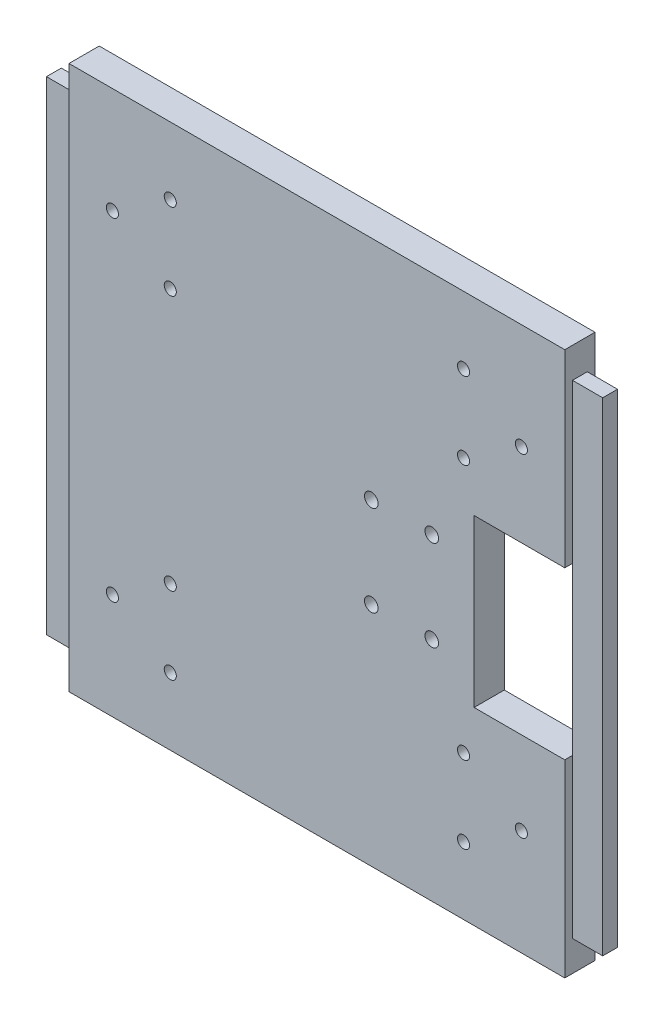
ISO-10303-21;
HEADER;
FILE_DESCRIPTION(('STEP AP214'),'2;1');
FILE_NAME('part.step','',(''),(''),'','','');
FILE_SCHEMA(('AUTOMOTIVE_DESIGN { 1 0 10303 214 1 1 1 1 }'));
ENDSEC;
DATA;
#1=APPLICATION_CONTEXT('core data for automotive mechanical design processes');
#2=APPLICATION_PROTOCOL_DEFINITION('international standard','automotive_design',2000,#1);
#3=PRODUCT_CONTEXT('',#1,'mechanical');
#4=PRODUCT('Part','Part','',(#3));
#5=PRODUCT_RELATED_PRODUCT_CATEGORY('part','',(#4));
#6=PRODUCT_DEFINITION_FORMATION('','',#4);
#7=PRODUCT_DEFINITION_CONTEXT('part definition',#1,'design');
#8=PRODUCT_DEFINITION('design','',#6,#7);
#9=PRODUCT_DEFINITION_SHAPE('','',#8);
#10=(LENGTH_UNIT() NAMED_UNIT(*) SI_UNIT(.MILLI.,.METRE.));
#11=(NAMED_UNIT(*) PLANE_ANGLE_UNIT() SI_UNIT($,.RADIAN.));
#12=(NAMED_UNIT(*) SI_UNIT($,.STERADIAN.) SOLID_ANGLE_UNIT());
#13=UNCERTAINTY_MEASURE_WITH_UNIT(LENGTH_MEASURE(1.E-05),#10,'distance_accuracy_value','');
#14=(GEOMETRIC_REPRESENTATION_CONTEXT(3) GLOBAL_UNCERTAINTY_ASSIGNED_CONTEXT((#13)) GLOBAL_UNIT_ASSIGNED_CONTEXT((#10,
#11,#12)) REPRESENTATION_CONTEXT('',''));
#15=CARTESIAN_POINT('',(0.,0.,0.));
#16=DIRECTION('',(0.,0.,1.));
#17=DIRECTION('',(1.,0.,0.));
#18=AXIS2_PLACEMENT_3D('',#15,#16,#17);
#19=CARTESIAN_POINT('',(164.,0.,10.));
#20=DIRECTION('',(-1.,0.,0.));
#21=DIRECTION('',(0.,0.,1.));
#22=AXIS2_PLACEMENT_3D('',#19,#20,#21);
#23=PLANE('',#22);
#24=DIRECTION('',(0.,0.,1.));
#25=VECTOR('',#24,1.);
#26=CARTESIAN_POINT('',(164.,117.5,0.));
#27=LINE('',#26,#25);
#28=CARTESIAN_POINT('',(164.,117.5,0.));
#29=VERTEX_POINT('',#28);
#30=CARTESIAN_POINT('',(164.,117.5,2.55));
#31=VERTEX_POINT('',#30);
#32=EDGE_CURVE('E52',#29,#31,#27,.T.);
#33=ORIENTED_EDGE('',*,*,#32,.F.);
#34=DIRECTION('',(0.,1.,0.));
#35=VECTOR('',#34,1.);
#36=CARTESIAN_POINT('',(164.,0.,0.));
#37=LINE('',#36,#35);
#38=CARTESIAN_POINT('',(164.,180.,0.));
#39=VERTEX_POINT('',#38);
#40=EDGE_CURVE('E390',#29,#39,#37,.T.);
#41=ORIENTED_EDGE('',*,*,#40,.T.);
#42=DIRECTION('',(0.,0.,-1.));
#43=VECTOR('',#42,1.);
#44=CARTESIAN_POINT('',(164.,180.,10.));
#45=LINE('',#44,#43);
#46=CARTESIAN_POINT('',(164.,180.,10.));
#47=VERTEX_POINT('',#46);
#48=EDGE_CURVE('E396',#47,#39,#45,.T.);
#49=ORIENTED_EDGE('',*,*,#48,.F.);
#50=DIRECTION('',(0.,1.,0.));
#51=VECTOR('',#50,1.);
#52=CARTESIAN_POINT('',(164.,0.,10.));
#53=LINE('',#52,#51);
#54=CARTESIAN_POINT('',(164.,117.5,10.));
#55=VERTEX_POINT('',#54);
#56=EDGE_CURVE('E379',#55,#47,#53,.T.);
#57=ORIENTED_EDGE('',*,*,#56,.F.);
#58=CARTESIAN_POINT('',(164.,117.5,7.45));
#59=VERTEX_POINT('',#58);
#60=EDGE_CURVE('E202',#59,#55,#27,.T.);
#61=ORIENTED_EDGE('',*,*,#60,.F.);
#62=DIRECTION('',(0.,1.,0.));
#63=VECTOR('',#62,1.);
#64=CARTESIAN_POINT('',(164.,169.95,7.44999999999999));
#65=LINE('',#64,#63);
#66=CARTESIAN_POINT('',(164.,169.95,7.44999999999999));
#67=VERTEX_POINT('',#66);
#68=EDGE_CURVE('E322',#59,#67,#65,.T.);
#69=ORIENTED_EDGE('',*,*,#68,.T.);
#70=DIRECTION('',(0.,0.,-1.));
#71=VECTOR('',#70,1.);
#72=CARTESIAN_POINT('',(164.,169.95,2.54999999999999));
#73=LINE('',#72,#71);
#74=CARTESIAN_POINT('',(164.,169.95,2.54999999999999));
#75=VERTEX_POINT('',#74);
#76=EDGE_CURVE('E319',#67,#75,#73,.T.);
#77=ORIENTED_EDGE('',*,*,#76,.T.);
#78=DIRECTION('',(0.,-1.,0.));
#79=VECTOR('',#78,1.);
#80=CARTESIAN_POINT('',(164.,169.95,2.54999999999999));
#81=LINE('',#80,#79);
#82=EDGE_CURVE('E316',#75,#31,#81,.T.);
#83=ORIENTED_EDGE('',*,*,#82,.T.);
#84=EDGE_LOOP('',(#33,#41,#49,#57,#61,#69,#77,#83));
#85=FACE_BOUND('',#84,.T.);
#86=ADVANCED_FACE('F37',(#85),#23,.F.);
#87=CARTESIAN_POINT('',(0.,0.,10.));
#88=DIRECTION('',(0.,0.,-1.));
#89=DIRECTION('',(-1.,0.,0.));
#90=AXIS2_PLACEMENT_3D('',#87,#88,#89);
#91=PLANE('',#90);
#92=CARTESIAN_POINT('',(149.642557300424,145.,10.));
#93=DIRECTION('',(0.,0.,-1.));
#94=DIRECTION('',(-1.,0.,0.));
#95=AXIS2_PLACEMENT_3D('',#92,#93,#94);
#96=CIRCLE('',#95,2.);
#97=CARTESIAN_POINT('',(147.642557300424,145.,10.));
#98=VERTEX_POINT('',#97);
#99=EDGE_CURVE('E296',#98,#98,#96,.T.);
#100=ORIENTED_EDGE('',*,*,#99,.T.);
#101=EDGE_LOOP('',(#100));
#102=FACE_BOUND('',#101,.T.);
#103=CARTESIAN_POINT('',(14.3574426995764,35.,10.));
#104=DIRECTION('',(0.,0.,-1.));
#105=DIRECTION('',(1.,0.,0.));
#106=AXIS2_PLACEMENT_3D('',#103,#104,#105);
#107=CIRCLE('',#106,2.);
#108=CARTESIAN_POINT('',(16.3574426995764,35.,10.));
#109=VERTEX_POINT('',#108);
#110=EDGE_CURVE('E243',#109,#109,#107,.T.);
#111=ORIENTED_EDGE('',*,*,#110,.T.);
#112=EDGE_LOOP('',(#111));
#113=FACE_BOUND('',#112,.T.);
#114=CARTESIAN_POINT('',(33.5,22.25,10.));
#115=DIRECTION('',(0.,0.,-1.));
#116=DIRECTION('',(1.,0.,0.));
#117=AXIS2_PLACEMENT_3D('',#114,#115,#116);
#118=CIRCLE('',#117,2.00000000000001);
#119=CARTESIAN_POINT('',(35.5,22.25,10.));
#120=VERTEX_POINT('',#119);
#121=EDGE_CURVE('E237',#120,#120,#118,.T.);
#122=ORIENTED_EDGE('',*,*,#121,.T.);
#123=EDGE_LOOP('',(#122));
#124=FACE_BOUND('',#123,.T.);
#125=CARTESIAN_POINT('',(33.5,47.75,10.));
#126=DIRECTION('',(0.,0.,-1.));
#127=DIRECTION('',(1.,0.,0.));
#128=AXIS2_PLACEMENT_3D('',#125,#126,#127);
#129=CIRCLE('',#128,2.);
#130=CARTESIAN_POINT('',(35.5,47.75,10.));
#131=VERTEX_POINT('',#130);
#132=EDGE_CURVE('E230',#131,#131,#129,.T.);
#133=ORIENTED_EDGE('',*,*,#132,.T.);
#134=EDGE_LOOP('',(#133));
#135=FACE_BOUND('',#134,.T.);
#136=CARTESIAN_POINT('',(130.5,157.75,10.));
#137=DIRECTION('',(0.,0.,-1.));
#138=DIRECTION('',(-1.,0.,0.));
#139=AXIS2_PLACEMENT_3D('',#136,#137,#138);
#140=CIRCLE('',#139,2.);
#141=CARTESIAN_POINT('',(128.5,157.75,10.));
#142=VERTEX_POINT('',#141);
#143=EDGE_CURVE('E272',#142,#142,#140,.T.);
#144=ORIENTED_EDGE('',*,*,#143,.T.);
#145=EDGE_LOOP('',(#144));
#146=FACE_BOUND('',#145,.T.);
#147=CARTESIAN_POINT('',(130.5,132.25,10.));
#148=DIRECTION('',(0.,0.,-1.));
#149=DIRECTION('',(-1.,0.,0.));
#150=AXIS2_PLACEMENT_3D('',#147,#148,#149);
#151=CIRCLE('',#150,2.);
#152=CARTESIAN_POINT('',(128.5,132.25,10.));
#153=VERTEX_POINT('',#152);
#154=EDGE_CURVE('E279',#153,#153,#151,.T.);
#155=ORIENTED_EDGE('',*,*,#154,.T.);
#156=EDGE_LOOP('',(#155));
#157=FACE_BOUND('',#156,.T.);
#158=CARTESIAN_POINT('',(14.3574426995764,145.,10.));
#159=DIRECTION('',(0.,0.,-1.));
#160=DIRECTION('',(-1.,0.,0.));
#161=AXIS2_PLACEMENT_3D('',#158,#159,#160);
#162=CIRCLE('',#161,2.);
#163=CARTESIAN_POINT('',(12.3574426995764,145.,10.));
#164=VERTEX_POINT('',#163);
#165=EDGE_CURVE('E285',#164,#164,#162,.T.);
#166=ORIENTED_EDGE('',*,*,#165,.T.);
#167=EDGE_LOOP('',(#166));
#168=FACE_BOUND('',#167,.T.);
#169=CARTESIAN_POINT('',(33.5,157.75,10.));
#170=DIRECTION('',(0.,0.,-1.));
#171=DIRECTION('',(-1.,0.,0.));
#172=AXIS2_PLACEMENT_3D('',#169,#170,#171);
#173=CIRCLE('',#172,2.00000000000001);
#174=CARTESIAN_POINT('',(31.5,157.75,10.));
#175=VERTEX_POINT('',#174);
#176=EDGE_CURVE('E291',#175,#175,#173,.T.);
#177=ORIENTED_EDGE('',*,*,#176,.T.);
#178=EDGE_LOOP('',(#177));
#179=FACE_BOUND('',#178,.T.);
#180=CARTESIAN_POINT('',(33.5,132.25,10.));
#181=DIRECTION('',(0.,0.,-1.));
#182=DIRECTION('',(-1.,0.,0.));
#183=AXIS2_PLACEMENT_3D('',#180,#181,#182);
#184=CIRCLE('',#183,2.);
#185=CARTESIAN_POINT('',(31.5,132.25,10.));
#186=VERTEX_POINT('',#185);
#187=EDGE_CURVE('E248',#186,#186,#184,.T.);
#188=ORIENTED_EDGE('',*,*,#187,.T.);
#189=EDGE_LOOP('',(#188));
#190=FACE_BOUND('',#189,.T.);
#191=CARTESIAN_POINT('',(130.5,47.75,10.));
#192=DIRECTION('',(0.,0.,-1.));
#193=DIRECTION('',(1.,0.,0.));
#194=AXIS2_PLACEMENT_3D('',#191,#192,#193);
#195=CIRCLE('',#194,2.);
#196=CARTESIAN_POINT('',(132.5,47.75,10.));
#197=VERTEX_POINT('',#196);
#198=EDGE_CURVE('E255',#197,#197,#195,.T.);
#199=ORIENTED_EDGE('',*,*,#198,.T.);
#200=EDGE_LOOP('',(#199));
#201=FACE_BOUND('',#200,.T.);
#202=CARTESIAN_POINT('',(130.5,22.25,10.));
#203=DIRECTION('',(0.,0.,-1.));
#204=DIRECTION('',(1.,0.,0.));
#205=AXIS2_PLACEMENT_3D('',#202,#203,#204);
#206=CIRCLE('',#205,2.);
#207=CARTESIAN_POINT('',(132.5,22.25,10.));
#208=VERTEX_POINT('',#207);
#209=EDGE_CURVE('E261',#208,#208,#206,.T.);
#210=ORIENTED_EDGE('',*,*,#209,.T.);
#211=EDGE_LOOP('',(#210));
#212=FACE_BOUND('',#211,.T.);
#213=CARTESIAN_POINT('',(149.642557300424,35.,10.));
#214=DIRECTION('',(0.,0.,-1.));
#215=DIRECTION('',(1.,0.,0.));
#216=AXIS2_PLACEMENT_3D('',#213,#214,#215);
#217=CIRCLE('',#216,2.);
#218=CARTESIAN_POINT('',(151.642557300424,35.,10.));
#219=VERTEX_POINT('',#218);
#220=EDGE_CURVE('E267',#219,#219,#217,.T.);
#221=ORIENTED_EDGE('',*,*,#220,.T.);
#222=EDGE_LOOP('',(#221));
#223=FACE_BOUND('',#222,.T.);
#224=CARTESIAN_POINT('',(120.,75.,10.));
#225=DIRECTION('',(0.,0.,1.));
#226=DIRECTION('',(1.,0.,0.));
#227=AXIS2_PLACEMENT_3D('',#224,#225,#226);
#228=CIRCLE('',#227,2.25);
#229=CARTESIAN_POINT('',(122.25,75.,10.));
#230=VERTEX_POINT('',#229);
#231=EDGE_CURVE('E221',#230,#230,#228,.T.);
#232=ORIENTED_EDGE('',*,*,#231,.F.);
#233=EDGE_LOOP('',(#232));
#234=FACE_BOUND('',#233,.T.);
#235=CARTESIAN_POINT('',(99.9999999999999,74.9999999999998,10.));
#236=DIRECTION('',(0.,0.,1.));
#237=DIRECTION('',(1.,0.,0.));
#238=AXIS2_PLACEMENT_3D('',#235,#236,#237);
#239=CIRCLE('',#238,2.25);
#240=CARTESIAN_POINT('',(102.25,74.9999999999998,10.));
#241=VERTEX_POINT('',#240);
#242=EDGE_CURVE('E215',#241,#241,#239,.T.);
#243=ORIENTED_EDGE('',*,*,#242,.F.);
#244=EDGE_LOOP('',(#243));
#245=FACE_BOUND('',#244,.T.);
#246=CARTESIAN_POINT('',(99.9999999999999,105.,10.));
#247=DIRECTION('',(0.,0.,1.));
#248=DIRECTION('',(1.,0.,0.));
#249=AXIS2_PLACEMENT_3D('',#246,#247,#248);
#250=CIRCLE('',#249,2.25);
#251=CARTESIAN_POINT('',(102.25,105.,10.));
#252=VERTEX_POINT('',#251);
#253=EDGE_CURVE('E209',#252,#252,#250,.T.);
#254=ORIENTED_EDGE('',*,*,#253,.F.);
#255=EDGE_LOOP('',(#254));
#256=FACE_BOUND('',#255,.T.);
#257=CARTESIAN_POINT('',(120.,105.,10.));
#258=DIRECTION('',(0.,0.,1.));
#259=DIRECTION('',(1.,0.,0.));
#260=AXIS2_PLACEMENT_3D('',#257,#258,#259);
#261=CIRCLE('',#260,2.25);
#262=CARTESIAN_POINT('',(122.25,105.,10.));
#263=VERTEX_POINT('',#262);
#264=EDGE_CURVE('E195',#263,#263,#261,.T.);
#265=ORIENTED_EDGE('',*,*,#264,.F.);
#266=EDGE_LOOP('',(#265));
#267=FACE_BOUND('',#266,.T.);
#268=DIRECTION('',(1.,0.,0.));
#269=VECTOR('',#268,1.);
#270=CARTESIAN_POINT('',(134.,117.5,10.));
#271=LINE('',#270,#269);
#272=CARTESIAN_POINT('',(134.,117.5,10.));
#273=VERTEX_POINT('',#272);
#274=EDGE_CURVE('E187',#273,#55,#271,.T.);
#275=ORIENTED_EDGE('',*,*,#274,.T.);
#276=ORIENTED_EDGE('',*,*,#56,.T.);
#277=DIRECTION('',(-1.,0.,0.));
#278=VECTOR('',#277,1.);
#279=CARTESIAN_POINT('',(0.,180.,10.));
#280=LINE('',#279,#278);
#281=CARTESIAN_POINT('',(0.,180.,10.));
#282=VERTEX_POINT('',#281);
#283=EDGE_CURVE('E383',#47,#282,#280,.T.);
#284=ORIENTED_EDGE('',*,*,#283,.T.);
#285=DIRECTION('',(0.,-1.,0.));
#286=VECTOR('',#285,1.);
#287=CARTESIAN_POINT('',(0.,0.,10.));
#288=LINE('',#287,#286);
#289=CARTESIAN_POINT('',(0.,0.,10.));
#290=VERTEX_POINT('',#289);
#291=EDGE_CURVE('E373',#282,#290,#288,.T.);
#292=ORIENTED_EDGE('',*,*,#291,.T.);
#293=DIRECTION('',(1.,0.,0.));
#294=VECTOR('',#293,1.);
#295=CARTESIAN_POINT('',(0.,0.,10.));
#296=LINE('',#295,#294);
#297=CARTESIAN_POINT('',(164.,0.,10.));
#298=VERTEX_POINT('',#297);
#299=EDGE_CURVE('E376',#290,#298,#296,.T.);
#300=ORIENTED_EDGE('',*,*,#299,.T.);
#301=CARTESIAN_POINT('',(164.,62.5,10.));
#302=VERTEX_POINT('',#301);
#303=EDGE_CURVE('E380',#298,#302,#53,.T.);
#304=ORIENTED_EDGE('',*,*,#303,.T.);
#305=DIRECTION('',(1.,0.,0.));
#306=VECTOR('',#305,1.);
#307=CARTESIAN_POINT('',(134.,62.5,10.));
#308=LINE('',#307,#306);
#309=CARTESIAN_POINT('',(134.,62.5,10.));
#310=VERTEX_POINT('',#309);
#311=EDGE_CURVE('E190',#310,#302,#308,.T.);
#312=ORIENTED_EDGE('',*,*,#311,.F.);
#313=DIRECTION('',(0.,-1.,0.));
#314=VECTOR('',#313,1.);
#315=CARTESIAN_POINT('',(134.,117.5,10.));
#316=LINE('',#315,#314);
#317=EDGE_CURVE('E170',#273,#310,#316,.T.);
#318=ORIENTED_EDGE('',*,*,#317,.F.);
#319=EDGE_LOOP('',(#275,#276,#284,#292,#300,#304,#312,#318));
#320=FACE_BOUND('',#319,.T.);
#321=ADVANCED_FACE('F440',(#102,#113,#124,#135,#146,#157,#168,#179,#190,#201,#212,#223,#234,
#245,#256,#267,#320),#91,.F.);
#322=CARTESIAN_POINT('',(0.,0.,0.));
#323=DIRECTION('',(0.,0.,-1.));
#324=DIRECTION('',(-1.,0.,0.));
#325=AXIS2_PLACEMENT_3D('',#322,#323,#324);
#326=PLANE('',#325);
#327=CARTESIAN_POINT('',(120.,105.,0.));
#328=DIRECTION('',(0.,0.,1.));
#329=DIRECTION('',(1.,0.,0.));
#330=AXIS2_PLACEMENT_3D('',#327,#328,#329);
#331=CIRCLE('',#330,2.25);
#332=CARTESIAN_POINT('',(122.25,105.,0.));
#333=VERTEX_POINT('',#332);
#334=EDGE_CURVE('E206',#333,#333,#331,.T.);
#335=ORIENTED_EDGE('',*,*,#334,.T.);
#336=EDGE_LOOP('',(#335));
#337=FACE_BOUND('',#336,.T.);
#338=CARTESIAN_POINT('',(99.9999999999999,105.,0.));
#339=DIRECTION('',(0.,0.,1.));
#340=DIRECTION('',(1.,0.,0.));
#341=AXIS2_PLACEMENT_3D('',#338,#339,#340);
#342=CIRCLE('',#341,2.25);
#343=CARTESIAN_POINT('',(102.25,105.,0.));
#344=VERTEX_POINT('',#343);
#345=EDGE_CURVE('E212',#344,#344,#342,.T.);
#346=ORIENTED_EDGE('',*,*,#345,.T.);
#347=EDGE_LOOP('',(#346));
#348=FACE_BOUND('',#347,.T.);
#349=CARTESIAN_POINT('',(99.9999999999999,74.9999999999998,0.));
#350=DIRECTION('',(0.,0.,1.));
#351=DIRECTION('',(1.,0.,0.));
#352=AXIS2_PLACEMENT_3D('',#349,#350,#351);
#353=CIRCLE('',#352,2.25);
#354=CARTESIAN_POINT('',(102.25,74.9999999999998,0.));
#355=VERTEX_POINT('',#354);
#356=EDGE_CURVE('E218',#355,#355,#353,.T.);
#357=ORIENTED_EDGE('',*,*,#356,.T.);
#358=EDGE_LOOP('',(#357));
#359=FACE_BOUND('',#358,.T.);
#360=CARTESIAN_POINT('',(120.,75.,0.));
#361=DIRECTION('',(0.,0.,1.));
#362=DIRECTION('',(1.,0.,0.));
#363=AXIS2_PLACEMENT_3D('',#360,#361,#362);
#364=CIRCLE('',#363,2.25);
#365=CARTESIAN_POINT('',(122.25,75.,0.));
#366=VERTEX_POINT('',#365);
#367=EDGE_CURVE('E224',#366,#366,#364,.T.);
#368=ORIENTED_EDGE('',*,*,#367,.T.);
#369=EDGE_LOOP('',(#368));
#370=FACE_BOUND('',#369,.T.);
#371=CARTESIAN_POINT('',(149.642557300424,35.,0.));
#372=DIRECTION('',(0.,0.,-1.));
#373=DIRECTION('',(1.,0.,0.));
#374=AXIS2_PLACEMENT_3D('',#371,#372,#373);
#375=CIRCLE('',#374,2.);
#376=CARTESIAN_POINT('',(151.642557300424,35.,0.));
#377=VERTEX_POINT('',#376);
#378=EDGE_CURVE('E233',#377,#377,#375,.T.);
#379=ORIENTED_EDGE('',*,*,#378,.F.);
#380=EDGE_LOOP('',(#379));
#381=FACE_BOUND('',#380,.T.);
#382=CARTESIAN_POINT('',(130.5,22.25,0.));
#383=DIRECTION('',(0.,0.,-1.));
#384=DIRECTION('',(1.,0.,0.));
#385=AXIS2_PLACEMENT_3D('',#382,#383,#384);
#386=CIRCLE('',#385,2.);
#387=CARTESIAN_POINT('',(132.5,22.25,0.));
#388=VERTEX_POINT('',#387);
#389=EDGE_CURVE('E264',#388,#388,#386,.T.);
#390=ORIENTED_EDGE('',*,*,#389,.F.);
#391=EDGE_LOOP('',(#390));
#392=FACE_BOUND('',#391,.T.);
#393=CARTESIAN_POINT('',(130.5,47.75,0.));
#394=DIRECTION('',(0.,0.,-1.));
#395=DIRECTION('',(1.,0.,0.));
#396=AXIS2_PLACEMENT_3D('',#393,#394,#395);
#397=CIRCLE('',#396,2.);
#398=CARTESIAN_POINT('',(132.5,47.75,0.));
#399=VERTEX_POINT('',#398);
#400=EDGE_CURVE('E258',#399,#399,#397,.T.);
#401=ORIENTED_EDGE('',*,*,#400,.F.);
#402=EDGE_LOOP('',(#401));
#403=FACE_BOUND('',#402,.T.);
#404=CARTESIAN_POINT('',(33.5,132.25,0.));
#405=DIRECTION('',(0.,0.,-1.));
#406=DIRECTION('',(-1.,0.,0.));
#407=AXIS2_PLACEMENT_3D('',#404,#405,#406);
#408=CIRCLE('',#407,2.);
#409=CARTESIAN_POINT('',(31.5,132.25,0.));
#410=VERTEX_POINT('',#409);
#411=EDGE_CURVE('E252',#410,#410,#408,.T.);
#412=ORIENTED_EDGE('',*,*,#411,.F.);
#413=EDGE_LOOP('',(#412));
#414=FACE_BOUND('',#413,.T.);
#415=CARTESIAN_POINT('',(33.5,157.75,0.));
#416=DIRECTION('',(0.,0.,-1.));
#417=DIRECTION('',(-1.,0.,0.));
#418=AXIS2_PLACEMENT_3D('',#415,#416,#417);
#419=CIRCLE('',#418,2.00000000000001);
#420=CARTESIAN_POINT('',(31.5,157.75,0.));
#421=VERTEX_POINT('',#420);
#422=EDGE_CURVE('E251',#421,#421,#419,.T.);
#423=ORIENTED_EDGE('',*,*,#422,.F.);
#424=EDGE_LOOP('',(#423));
#425=FACE_BOUND('',#424,.T.);
#426=CARTESIAN_POINT('',(14.3574426995764,145.,0.));
#427=DIRECTION('',(0.,0.,-1.));
#428=DIRECTION('',(-1.,0.,0.));
#429=AXIS2_PLACEMENT_3D('',#426,#427,#428);
#430=CIRCLE('',#429,2.);
#431=CARTESIAN_POINT('',(12.3574426995764,145.,0.));
#432=VERTEX_POINT('',#431);
#433=EDGE_CURVE('E288',#432,#432,#430,.T.);
#434=ORIENTED_EDGE('',*,*,#433,.F.);
#435=EDGE_LOOP('',(#434));
#436=FACE_BOUND('',#435,.T.);
#437=CARTESIAN_POINT('',(130.5,132.25,0.));
#438=DIRECTION('',(0.,0.,-1.));
#439=DIRECTION('',(-1.,0.,0.));
#440=AXIS2_PLACEMENT_3D('',#437,#438,#439);
#441=CIRCLE('',#440,2.);
#442=CARTESIAN_POINT('',(128.5,132.25,0.));
#443=VERTEX_POINT('',#442);
#444=EDGE_CURVE('E282',#443,#443,#441,.T.);
#445=ORIENTED_EDGE('',*,*,#444,.F.);
#446=EDGE_LOOP('',(#445));
#447=FACE_BOUND('',#446,.T.);
#448=CARTESIAN_POINT('',(130.5,157.75,0.));
#449=DIRECTION('',(0.,0.,-1.));
#450=DIRECTION('',(-1.,0.,0.));
#451=AXIS2_PLACEMENT_3D('',#448,#449,#450);
#452=CIRCLE('',#451,2.);
#453=CARTESIAN_POINT('',(128.5,157.75,0.));
#454=VERTEX_POINT('',#453);
#455=EDGE_CURVE('E276',#454,#454,#452,.T.);
#456=ORIENTED_EDGE('',*,*,#455,.F.);
#457=EDGE_LOOP('',(#456));
#458=FACE_BOUND('',#457,.T.);
#459=CARTESIAN_POINT('',(33.5,47.75,0.));
#460=DIRECTION('',(0.,0.,-1.));
#461=DIRECTION('',(1.,0.,0.));
#462=AXIS2_PLACEMENT_3D('',#459,#460,#461);
#463=CIRCLE('',#462,2.);
#464=CARTESIAN_POINT('',(35.5,47.75,0.));
#465=VERTEX_POINT('',#464);
#466=EDGE_CURVE('E234',#465,#465,#463,.T.);
#467=ORIENTED_EDGE('',*,*,#466,.F.);
#468=EDGE_LOOP('',(#467));
#469=FACE_BOUND('',#468,.T.);
#470=CARTESIAN_POINT('',(33.5,22.25,0.));
#471=DIRECTION('',(0.,0.,-1.));
#472=DIRECTION('',(1.,0.,0.));
#473=AXIS2_PLACEMENT_3D('',#470,#471,#472);
#474=CIRCLE('',#473,2.00000000000001);
#475=CARTESIAN_POINT('',(35.5,22.25,0.));
#476=VERTEX_POINT('',#475);
#477=EDGE_CURVE('E240',#476,#476,#474,.T.);
#478=ORIENTED_EDGE('',*,*,#477,.F.);
#479=EDGE_LOOP('',(#478));
#480=FACE_BOUND('',#479,.T.);
#481=CARTESIAN_POINT('',(14.3574426995764,35.,0.));
#482=DIRECTION('',(0.,0.,-1.));
#483=DIRECTION('',(1.,0.,0.));
#484=AXIS2_PLACEMENT_3D('',#481,#482,#483);
#485=CIRCLE('',#484,2.);
#486=CARTESIAN_POINT('',(16.3574426995764,35.,0.));
#487=VERTEX_POINT('',#486);
#488=EDGE_CURVE('E229',#487,#487,#485,.T.);
#489=ORIENTED_EDGE('',*,*,#488,.F.);
#490=EDGE_LOOP('',(#489));
#491=FACE_BOUND('',#490,.T.);
#492=CARTESIAN_POINT('',(149.642557300424,145.,0.));
#493=DIRECTION('',(0.,0.,-1.));
#494=DIRECTION('',(-1.,0.,0.));
#495=AXIS2_PLACEMENT_3D('',#492,#493,#494);
#496=CIRCLE('',#495,2.);
#497=CARTESIAN_POINT('',(147.642557300424,145.,0.));
#498=VERTEX_POINT('',#497);
#499=EDGE_CURVE('E275',#498,#498,#496,.T.);
#500=ORIENTED_EDGE('',*,*,#499,.F.);
#501=EDGE_LOOP('',(#500));
#502=FACE_BOUND('',#501,.T.);
#503=ORIENTED_EDGE('',*,*,#40,.F.);
#504=DIRECTION('',(1.,0.,0.));
#505=VECTOR('',#504,1.);
#506=CARTESIAN_POINT('',(134.,117.5,0.));
#507=LINE('',#506,#505);
#508=CARTESIAN_POINT('',(134.,117.5,0.));
#509=VERTEX_POINT('',#508);
#510=EDGE_CURVE('E174',#509,#29,#507,.T.);
#511=ORIENTED_EDGE('',*,*,#510,.F.);
#512=DIRECTION('',(0.,-1.,0.));
#513=VECTOR('',#512,1.);
#514=CARTESIAN_POINT('',(134.,117.5,0.));
#515=LINE('',#514,#513);
#516=CARTESIAN_POINT('',(134.,62.5,0.));
#517=VERTEX_POINT('',#516);
#518=EDGE_CURVE('E167',#509,#517,#515,.T.);
#519=ORIENTED_EDGE('',*,*,#518,.T.);
#520=DIRECTION('',(1.,0.,0.));
#521=VECTOR('',#520,1.);
#522=CARTESIAN_POINT('',(134.,62.5,0.));
#523=LINE('',#522,#521);
#524=CARTESIAN_POINT('',(164.,62.5,0.));
#525=VERTEX_POINT('',#524);
#526=EDGE_CURVE('E177',#517,#525,#523,.T.);
#527=ORIENTED_EDGE('',*,*,#526,.T.);
#528=CARTESIAN_POINT('',(164.,0.,0.));
#529=VERTEX_POINT('',#528);
#530=EDGE_CURVE('E391',#529,#525,#37,.T.);
#531=ORIENTED_EDGE('',*,*,#530,.F.);
#532=DIRECTION('',(1.,0.,0.));
#533=VECTOR('',#532,1.);
#534=CARTESIAN_POINT('',(0.,0.,0.));
#535=LINE('',#534,#533);
#536=CARTESIAN_POINT('',(0.,0.,0.));
#537=VERTEX_POINT('',#536);
#538=EDGE_CURVE('E388',#537,#529,#535,.T.);
#539=ORIENTED_EDGE('',*,*,#538,.F.);
#540=DIRECTION('',(0.,-1.,0.));
#541=VECTOR('',#540,1.);
#542=CARTESIAN_POINT('',(0.,0.,0.));
#543=LINE('',#542,#541);
#544=CARTESIAN_POINT('',(0.,180.,0.));
#545=VERTEX_POINT('',#544);
#546=EDGE_CURVE('E372',#545,#537,#543,.T.);
#547=ORIENTED_EDGE('',*,*,#546,.F.);
#548=DIRECTION('',(-1.,0.,0.));
#549=VECTOR('',#548,1.);
#550=CARTESIAN_POINT('',(0.,180.,0.));
#551=LINE('',#550,#549);
#552=EDGE_CURVE('E377',#39,#545,#551,.T.);
#553=ORIENTED_EDGE('',*,*,#552,.F.);
#554=EDGE_LOOP('',(#503,#511,#519,#527,#531,#539,#547,#553));
#555=FACE_BOUND('',#554,.T.);
#556=ADVANCED_FACE('F186',(#337,#348,#359,#370,#381,#392,#403,#414,#425,#436,#447,#458,#469,
#480,#491,#502,#555),#326,.T.);
#557=CARTESIAN_POINT('',(0.,0.,10.));
#558=DIRECTION('',(1.,0.,0.));
#559=DIRECTION('',(0.,0.,-1.));
#560=AXIS2_PLACEMENT_3D('',#557,#558,#559);
#561=PLANE('',#560);
#562=ORIENTED_EDGE('',*,*,#546,.T.);
#563=DIRECTION('',(0.,0.,-1.));
#564=VECTOR('',#563,1.);
#565=CARTESIAN_POINT('',(0.,0.,10.));
#566=LINE('',#565,#564);
#567=EDGE_CURVE('E11',#290,#537,#566,.T.);
#568=ORIENTED_EDGE('',*,*,#567,.F.);
#569=ORIENTED_EDGE('',*,*,#291,.F.);
#570=DIRECTION('',(0.,0.,-1.));
#571=VECTOR('',#570,1.);
#572=CARTESIAN_POINT('',(0.,180.,10.));
#573=LINE('',#572,#571);
#574=EDGE_CURVE('E385',#282,#545,#573,.T.);
#575=ORIENTED_EDGE('',*,*,#574,.T.);
#576=EDGE_LOOP('',(#562,#568,#569,#575));
#577=FACE_BOUND('',#576,.T.);
#578=DIRECTION('',(0.,-1.,0.));
#579=VECTOR('',#578,1.);
#580=CARTESIAN_POINT('',(0.,169.95,2.54999999999999));
#581=LINE('',#580,#579);
#582=CARTESIAN_POINT('',(0.,169.95,2.54999999999999));
#583=VERTEX_POINT('',#582);
#584=CARTESIAN_POINT('',(0.,10.05,2.55000000000001));
#585=VERTEX_POINT('',#584);
#586=EDGE_CURVE('E339',#583,#585,#581,.T.);
#587=ORIENTED_EDGE('',*,*,#586,.F.);
#588=DIRECTION('',(0.,0.,-1.));
#589=VECTOR('',#588,1.);
#590=CARTESIAN_POINT('',(0.,169.95,2.54999999999999));
#591=LINE('',#590,#589);
#592=CARTESIAN_POINT('',(0.,169.95,7.44999999999999));
#593=VERTEX_POINT('',#592);
#594=EDGE_CURVE('E344',#593,#583,#591,.T.);
#595=ORIENTED_EDGE('',*,*,#594,.F.);
#596=DIRECTION('',(0.,1.,0.));
#597=VECTOR('',#596,1.);
#598=CARTESIAN_POINT('',(0.,169.95,7.44999999999999));
#599=LINE('',#598,#597);
#600=CARTESIAN_POINT('',(0.,10.05,7.45000000000001));
#601=VERTEX_POINT('',#600);
#602=EDGE_CURVE('E356',#601,#593,#599,.T.);
#603=ORIENTED_EDGE('',*,*,#602,.F.);
#604=DIRECTION('',(0.,0.,1.));
#605=VECTOR('',#604,1.);
#606=CARTESIAN_POINT('',(0.,10.05,2.55000000000001));
#607=LINE('',#606,#605);
#608=EDGE_CURVE('E353',#585,#601,#607,.T.);
#609=ORIENTED_EDGE('',*,*,#608,.F.);
#610=EDGE_LOOP('',(#587,#595,#603,#609));
#611=FACE_BOUND('',#610,.T.);
#612=ADVANCED_FACE('F39',(#577,#611),#561,.F.);
#613=CARTESIAN_POINT('',(0.,0.,10.));
#614=DIRECTION('',(0.,1.,0.));
#615=DIRECTION('',(0.,0.,1.));
#616=AXIS2_PLACEMENT_3D('',#613,#614,#615);
#617=PLANE('',#616);
#618=ORIENTED_EDGE('',*,*,#538,.T.);
#619=DIRECTION('',(0.,0.,-1.));
#620=VECTOR('',#619,1.);
#621=CARTESIAN_POINT('',(164.,0.,10.));
#622=LINE('',#621,#620);
#623=EDGE_CURVE('E45',#298,#529,#622,.T.);
#624=ORIENTED_EDGE('',*,*,#623,.F.);
#625=ORIENTED_EDGE('',*,*,#299,.F.);
#626=ORIENTED_EDGE('',*,*,#567,.T.);
#627=EDGE_LOOP('',(#618,#624,#625,#626));
#628=FACE_BOUND('',#627,.T.);
#629=ADVANCED_FACE('F408',(#628),#617,.F.);
#630=ORIENTED_EDGE('',*,*,#530,.T.);
#631=DIRECTION('',(0.,0.,1.));
#632=VECTOR('',#631,1.);
#633=CARTESIAN_POINT('',(164.,62.5,0.));
#634=LINE('',#633,#632);
#635=CARTESIAN_POINT('',(164.,62.5,2.55));
#636=VERTEX_POINT('',#635);
#637=EDGE_CURVE('E180',#525,#636,#634,.T.);
#638=ORIENTED_EDGE('',*,*,#637,.T.);
#639=CARTESIAN_POINT('',(164.,10.05,2.55000000000001));
#640=VERTEX_POINT('',#639);
#641=EDGE_CURVE('E299',#636,#640,#81,.T.);
#642=ORIENTED_EDGE('',*,*,#641,.T.);
#643=DIRECTION('',(0.,0.,1.));
#644=VECTOR('',#643,1.);
#645=CARTESIAN_POINT('',(164.,10.05,2.55000000000001));
#646=LINE('',#645,#644);
#647=CARTESIAN_POINT('',(164.,10.05,7.45000000000001));
#648=VERTEX_POINT('',#647);
#649=EDGE_CURVE('E306',#640,#648,#646,.T.);
#650=ORIENTED_EDGE('',*,*,#649,.T.);
#651=CARTESIAN_POINT('',(164.,62.5,7.45));
#652=VERTEX_POINT('',#651);
#653=EDGE_CURVE('E323',#648,#652,#65,.T.);
#654=ORIENTED_EDGE('',*,*,#653,.T.);
#655=EDGE_CURVE('E173',#652,#302,#634,.T.);
#656=ORIENTED_EDGE('',*,*,#655,.T.);
#657=ORIENTED_EDGE('',*,*,#303,.F.);
#658=ORIENTED_EDGE('',*,*,#623,.T.);
#659=EDGE_LOOP('',(#630,#638,#642,#650,#654,#656,#657,#658));
#660=FACE_BOUND('',#659,.T.);
#661=ADVANCED_FACE('F402',(#660),#23,.F.);
#662=CARTESIAN_POINT('',(0.,180.,10.));
#663=DIRECTION('',(0.,-1.,0.));
#664=DIRECTION('',(0.,0.,-1.));
#665=AXIS2_PLACEMENT_3D('',#662,#663,#664);
#666=PLANE('',#665);
#667=ORIENTED_EDGE('',*,*,#552,.T.);
#668=ORIENTED_EDGE('',*,*,#574,.F.);
#669=ORIENTED_EDGE('',*,*,#283,.F.);
#670=ORIENTED_EDGE('',*,*,#48,.T.);
#671=EDGE_LOOP('',(#667,#668,#669,#670));
#672=FACE_BOUND('',#671,.T.);
#673=ADVANCED_FACE('F415',(#672),#666,.F.);
#674=CARTESIAN_POINT('',(-10.,169.95,2.54999999999999));
#675=DIRECTION('',(0.,0.,1.));
#676=DIRECTION('',(0.,-1.,0.));
#677=AXIS2_PLACEMENT_3D('',#674,#675,#676);
#678=PLANE('',#677);
#679=ORIENTED_EDGE('',*,*,#586,.T.);
#680=DIRECTION('',(1.,0.,0.));
#681=VECTOR('',#680,1.);
#682=CARTESIAN_POINT('',(-10.,10.05,2.55000000000001));
#683=LINE('',#682,#681);
#684=CARTESIAN_POINT('',(-10.,10.05,2.55000000000001));
#685=VERTEX_POINT('',#684);
#686=EDGE_CURVE('E369',#685,#585,#683,.T.);
#687=ORIENTED_EDGE('',*,*,#686,.F.);
#688=DIRECTION('',(0.,-1.,0.));
#689=VECTOR('',#688,1.);
#690=CARTESIAN_POINT('',(-10.,169.95,2.54999999999999));
#691=LINE('',#690,#689);
#692=CARTESIAN_POINT('',(-10.,169.95,2.54999999999999));
#693=VERTEX_POINT('',#692);
#694=EDGE_CURVE('E340',#693,#685,#691,.T.);
#695=ORIENTED_EDGE('',*,*,#694,.F.);
#696=DIRECTION('',(1.,0.,0.));
#697=VECTOR('',#696,1.);
#698=CARTESIAN_POINT('',(-10.,169.95,2.54999999999999));
#699=LINE('',#698,#697);
#700=EDGE_CURVE('E350',#693,#583,#699,.T.);
#701=ORIENTED_EDGE('',*,*,#700,.T.);
#702=EDGE_LOOP('',(#679,#687,#695,#701));
#703=FACE_BOUND('',#702,.T.);
#704=ADVANCED_FACE('F467',(#703),#678,.F.);
#705=CARTESIAN_POINT('',(-10.,10.05,2.55000000000001));
#706=DIRECTION('',(0.,1.,0.));
#707=DIRECTION('',(0.,0.,1.));
#708=AXIS2_PLACEMENT_3D('',#705,#706,#707);
#709=PLANE('',#708);
#710=ORIENTED_EDGE('',*,*,#608,.T.);
#711=DIRECTION('',(1.,0.,0.));
#712=VECTOR('',#711,1.);
#713=CARTESIAN_POINT('',(-10.,10.05,7.45000000000001));
#714=LINE('',#713,#712);
#715=CARTESIAN_POINT('',(-10.,10.05,7.45000000000001));
#716=VERTEX_POINT('',#715);
#717=EDGE_CURVE('E366',#716,#601,#714,.T.);
#718=ORIENTED_EDGE('',*,*,#717,.F.);
#719=DIRECTION('',(0.,0.,1.));
#720=VECTOR('',#719,1.);
#721=CARTESIAN_POINT('',(-10.,10.05,2.55000000000001));
#722=LINE('',#721,#720);
#723=EDGE_CURVE('E343',#685,#716,#722,.T.);
#724=ORIENTED_EDGE('',*,*,#723,.F.);
#725=ORIENTED_EDGE('',*,*,#686,.T.);
#726=EDGE_LOOP('',(#710,#718,#724,#725));
#727=FACE_BOUND('',#726,.T.);
#728=ADVANCED_FACE('F482',(#727),#709,.F.);
#729=CARTESIAN_POINT('',(-10.,169.95,7.44999999999999));
#730=DIRECTION('',(0.,0.,-1.));
#731=DIRECTION('',(0.,1.,0.));
#732=AXIS2_PLACEMENT_3D('',#729,#730,#731);
#733=PLANE('',#732);
#734=ORIENTED_EDGE('',*,*,#602,.T.);
#735=DIRECTION('',(1.,0.,0.));
#736=VECTOR('',#735,1.);
#737=CARTESIAN_POINT('',(-10.,169.95,7.44999999999999));
#738=LINE('',#737,#736);
#739=CARTESIAN_POINT('',(-10.,169.95,7.44999999999999));
#740=VERTEX_POINT('',#739);
#741=EDGE_CURVE('E363',#740,#593,#738,.T.);
#742=ORIENTED_EDGE('',*,*,#741,.F.);
#743=DIRECTION('',(0.,1.,0.));
#744=VECTOR('',#743,1.);
#745=CARTESIAN_POINT('',(-10.,169.95,7.44999999999999));
#746=LINE('',#745,#744);
#747=EDGE_CURVE('E346',#716,#740,#746,.T.);
#748=ORIENTED_EDGE('',*,*,#747,.F.);
#749=ORIENTED_EDGE('',*,*,#717,.T.);
#750=EDGE_LOOP('',(#734,#742,#748,#749));
#751=FACE_BOUND('',#750,.T.);
#752=ADVANCED_FACE('F486',(#751),#733,.F.);
#753=CARTESIAN_POINT('',(-10.,169.95,2.54999999999999));
#754=DIRECTION('',(0.,-1.,0.));
#755=DIRECTION('',(0.,0.,-1.));
#756=AXIS2_PLACEMENT_3D('',#753,#754,#755);
#757=PLANE('',#756);
#758=ORIENTED_EDGE('',*,*,#594,.T.);
#759=ORIENTED_EDGE('',*,*,#700,.F.);
#760=DIRECTION('',(0.,0.,-1.));
#761=VECTOR('',#760,1.);
#762=CARTESIAN_POINT('',(-10.,169.95,2.54999999999999));
#763=LINE('',#762,#761);
#764=EDGE_CURVE('E348',#740,#693,#763,.T.);
#765=ORIENTED_EDGE('',*,*,#764,.F.);
#766=ORIENTED_EDGE('',*,*,#741,.T.);
#767=EDGE_LOOP('',(#758,#759,#765,#766));
#768=FACE_BOUND('',#767,.T.);
#769=ADVANCED_FACE('F490',(#768),#757,.F.);
#770=CARTESIAN_POINT('',(-10.,0.,0.));
#771=DIRECTION('',(-1.,0.,0.));
#772=DIRECTION('',(0.,0.,1.));
#773=AXIS2_PLACEMENT_3D('',#770,#771,#772);
#774=PLANE('',#773);
#775=ORIENTED_EDGE('',*,*,#694,.T.);
#776=ORIENTED_EDGE('',*,*,#723,.T.);
#777=ORIENTED_EDGE('',*,*,#747,.T.);
#778=ORIENTED_EDGE('',*,*,#764,.T.);
#779=EDGE_LOOP('',(#775,#776,#777,#778));
#780=FACE_BOUND('',#779,.T.);
#781=ADVANCED_FACE('F494',(#780),#774,.T.);
#782=CARTESIAN_POINT('',(174.,169.95,2.54999999999999));
#783=DIRECTION('',(0.,0.,-1.));
#784=DIRECTION('',(0.,1.,0.));
#785=AXIS2_PLACEMENT_3D('',#782,#783,#784);
#786=PLANE('',#785);
#787=ORIENTED_EDGE('',*,*,#82,.F.);
#788=DIRECTION('',(-1.,0.,0.));
#789=VECTOR('',#788,1.);
#790=CARTESIAN_POINT('',(174.,169.95,2.54999999999999));
#791=LINE('',#790,#789);
#792=CARTESIAN_POINT('',(174.,169.95,2.54999999999999));
#793=VERTEX_POINT('',#792);
#794=EDGE_CURVE('E336',#793,#75,#791,.T.);
#795=ORIENTED_EDGE('',*,*,#794,.F.);
#796=DIRECTION('',(0.,-1.,0.));
#797=VECTOR('',#796,1.);
#798=CARTESIAN_POINT('',(174.,169.95,2.54999999999999));
#799=LINE('',#798,#797);
#800=CARTESIAN_POINT('',(174.,10.05,2.55000000000001));
#801=VERTEX_POINT('',#800);
#802=EDGE_CURVE('E302',#793,#801,#799,.T.);
#803=ORIENTED_EDGE('',*,*,#802,.T.);
#804=DIRECTION('',(-1.,0.,0.));
#805=VECTOR('',#804,1.);
#806=CARTESIAN_POINT('',(174.,10.05,2.55000000000001));
#807=LINE('',#806,#805);
#808=EDGE_CURVE('E315',#801,#640,#807,.T.);
#809=ORIENTED_EDGE('',*,*,#808,.T.);
#810=ORIENTED_EDGE('',*,*,#641,.F.);
#811=DIRECTION('',(0.,1.,0.));
#812=VECTOR('',#811,1.);
#813=CARTESIAN_POINT('',(164.,169.95,2.54999999999999));
#814=LINE('',#813,#812);
#815=EDGE_CURVE('E199',#636,#31,#814,.T.);
#816=ORIENTED_EDGE('',*,*,#815,.T.);
#817=EDGE_LOOP('',(#787,#795,#803,#809,#810,#816));
#818=FACE_BOUND('',#817,.T.);
#819=ADVANCED_FACE('F421',(#818),#786,.T.);
#820=CARTESIAN_POINT('',(174.,169.95,2.54999999999999));
#821=DIRECTION('',(0.,1.,0.));
#822=DIRECTION('',(0.,0.,1.));
#823=AXIS2_PLACEMENT_3D('',#820,#821,#822);
#824=PLANE('',#823);
#825=ORIENTED_EDGE('',*,*,#76,.F.);
#826=DIRECTION('',(-1.,0.,0.));
#827=VECTOR('',#826,1.);
#828=CARTESIAN_POINT('',(174.,169.95,7.44999999999999));
#829=LINE('',#828,#827);
#830=CARTESIAN_POINT('',(174.,169.95,7.44999999999999));
#831=VERTEX_POINT('',#830);
#832=EDGE_CURVE('E333',#831,#67,#829,.T.);
#833=ORIENTED_EDGE('',*,*,#832,.F.);
#834=DIRECTION('',(0.,0.,-1.));
#835=VECTOR('',#834,1.);
#836=CARTESIAN_POINT('',(174.,169.95,2.54999999999999));
#837=LINE('',#836,#835);
#838=EDGE_CURVE('E305',#831,#793,#837,.T.);
#839=ORIENTED_EDGE('',*,*,#838,.T.);
#840=ORIENTED_EDGE('',*,*,#794,.T.);
#841=EDGE_LOOP('',(#825,#833,#839,#840));
#842=FACE_BOUND('',#841,.T.);
#843=ADVANCED_FACE('F425',(#842),#824,.T.);
#844=CARTESIAN_POINT('',(174.,169.95,7.44999999999999));
#845=DIRECTION('',(0.,0.,1.));
#846=DIRECTION('',(0.,-1.,0.));
#847=AXIS2_PLACEMENT_3D('',#844,#845,#846);
#848=PLANE('',#847);
#849=ORIENTED_EDGE('',*,*,#653,.F.);
#850=DIRECTION('',(-1.,0.,0.));
#851=VECTOR('',#850,1.);
#852=CARTESIAN_POINT('',(174.,10.05,7.45000000000001));
#853=LINE('',#852,#851);
#854=CARTESIAN_POINT('',(174.,10.05,7.45000000000001));
#855=VERTEX_POINT('',#854);
#856=EDGE_CURVE('E331',#855,#648,#853,.T.);
#857=ORIENTED_EDGE('',*,*,#856,.F.);
#858=DIRECTION('',(0.,1.,0.));
#859=VECTOR('',#858,1.);
#860=CARTESIAN_POINT('',(174.,169.95,7.44999999999999));
#861=LINE('',#860,#859);
#862=EDGE_CURVE('E309',#855,#831,#861,.T.);
#863=ORIENTED_EDGE('',*,*,#862,.T.);
#864=ORIENTED_EDGE('',*,*,#832,.T.);
#865=ORIENTED_EDGE('',*,*,#68,.F.);
#866=EDGE_CURVE('E326',#652,#59,#65,.T.);
#867=ORIENTED_EDGE('',*,*,#866,.F.);
#868=EDGE_LOOP('',(#849,#857,#863,#864,#865,#867));
#869=FACE_BOUND('',#868,.T.);
#870=ADVANCED_FACE('F433',(#869),#848,.T.);
#871=CARTESIAN_POINT('',(174.,10.05,2.55000000000001));
#872=DIRECTION('',(0.,-1.,0.));
#873=DIRECTION('',(0.,0.,-1.));
#874=AXIS2_PLACEMENT_3D('',#871,#872,#873);
#875=PLANE('',#874);
#876=ORIENTED_EDGE('',*,*,#649,.F.);
#877=ORIENTED_EDGE('',*,*,#808,.F.);
#878=DIRECTION('',(0.,0.,1.));
#879=VECTOR('',#878,1.);
#880=CARTESIAN_POINT('',(174.,10.05,2.55000000000001));
#881=LINE('',#880,#879);
#882=EDGE_CURVE('E312',#801,#855,#881,.T.);
#883=ORIENTED_EDGE('',*,*,#882,.T.);
#884=ORIENTED_EDGE('',*,*,#856,.T.);
#885=EDGE_LOOP('',(#876,#877,#883,#884));
#886=FACE_BOUND('',#885,.T.);
#887=ADVANCED_FACE('F438',(#886),#875,.T.);
#888=CARTESIAN_POINT('',(174.,0.,0.));
#889=DIRECTION('',(1.,0.,0.));
#890=DIRECTION('',(0.,0.,1.));
#891=AXIS2_PLACEMENT_3D('',#888,#889,#890);
#892=PLANE('',#891);
#893=ORIENTED_EDGE('',*,*,#802,.F.);
#894=ORIENTED_EDGE('',*,*,#838,.F.);
#895=ORIENTED_EDGE('',*,*,#862,.F.);
#896=ORIENTED_EDGE('',*,*,#882,.F.);
#897=EDGE_LOOP('',(#893,#894,#895,#896));
#898=FACE_BOUND('',#897,.T.);
#899=ADVANCED_FACE('F429',(#898),#892,.T.);
#900=CARTESIAN_POINT('',(149.642557300424,145.,10.));
#901=DIRECTION('',(0.,0.,-1.));
#902=DIRECTION('',(-1.,0.,0.));
#903=AXIS2_PLACEMENT_3D('',#900,#901,#902);
#904=CYLINDRICAL_SURFACE('',#903,2.);
#905=ORIENTED_EDGE('',*,*,#99,.F.);
#906=EDGE_LOOP('',(#905));
#907=FACE_BOUND('',#906,.T.);
#908=ORIENTED_EDGE('',*,*,#499,.T.);
#909=EDGE_LOOP('',(#908));
#910=FACE_BOUND('',#909,.T.);
#911=ADVANCED_FACE('F509',(#907,#910),#904,.F.);
#912=CARTESIAN_POINT('',(14.3574426995764,35.,10.));
#913=DIRECTION('',(0.,0.,-1.));
#914=DIRECTION('',(-1.,0.,0.));
#915=AXIS2_PLACEMENT_3D('',#912,#913,#914);
#916=CYLINDRICAL_SURFACE('',#915,2.);
#917=ORIENTED_EDGE('',*,*,#110,.F.);
#918=EDGE_LOOP('',(#917));
#919=FACE_BOUND('',#918,.T.);
#920=ORIENTED_EDGE('',*,*,#488,.T.);
#921=EDGE_LOOP('',(#920));
#922=FACE_BOUND('',#921,.T.);
#923=ADVANCED_FACE('F512',(#919,#922),#916,.F.);
#924=CARTESIAN_POINT('',(33.5,22.25,10.));
#925=DIRECTION('',(0.,0.,-1.));
#926=DIRECTION('',(-1.,0.,0.));
#927=AXIS2_PLACEMENT_3D('',#924,#925,#926);
#928=CYLINDRICAL_SURFACE('',#927,2.00000000000001);
#929=ORIENTED_EDGE('',*,*,#121,.F.);
#930=EDGE_LOOP('',(#929));
#931=FACE_BOUND('',#930,.T.);
#932=ORIENTED_EDGE('',*,*,#477,.T.);
#933=EDGE_LOOP('',(#932));
#934=FACE_BOUND('',#933,.T.);
#935=ADVANCED_FACE('F548',(#931,#934),#928,.F.);
#936=CARTESIAN_POINT('',(33.5,47.75,10.));
#937=DIRECTION('',(0.,0.,-1.));
#938=DIRECTION('',(-1.,0.,0.));
#939=AXIS2_PLACEMENT_3D('',#936,#937,#938);
#940=CYLINDRICAL_SURFACE('',#939,2.);
#941=ORIENTED_EDGE('',*,*,#132,.F.);
#942=EDGE_LOOP('',(#941));
#943=FACE_BOUND('',#942,.T.);
#944=ORIENTED_EDGE('',*,*,#466,.T.);
#945=EDGE_LOOP('',(#944));
#946=FACE_BOUND('',#945,.T.);
#947=ADVANCED_FACE('F530',(#943,#946),#940,.F.);
#948=CARTESIAN_POINT('',(130.5,157.75,10.));
#949=DIRECTION('',(0.,0.,-1.));
#950=DIRECTION('',(-1.,0.,0.));
#951=AXIS2_PLACEMENT_3D('',#948,#949,#950);
#952=CYLINDRICAL_SURFACE('',#951,2.);
#953=ORIENTED_EDGE('',*,*,#143,.F.);
#954=EDGE_LOOP('',(#953));
#955=FACE_BOUND('',#954,.T.);
#956=ORIENTED_EDGE('',*,*,#455,.T.);
#957=EDGE_LOOP('',(#956));
#958=FACE_BOUND('',#957,.T.);
#959=ADVANCED_FACE('F526',(#955,#958),#952,.F.);
#960=CARTESIAN_POINT('',(130.5,132.25,10.));
#961=DIRECTION('',(0.,0.,-1.));
#962=DIRECTION('',(-1.,0.,0.));
#963=AXIS2_PLACEMENT_3D('',#960,#961,#962);
#964=CYLINDRICAL_SURFACE('',#963,2.);
#965=ORIENTED_EDGE('',*,*,#154,.F.);
#966=EDGE_LOOP('',(#965));
#967=FACE_BOUND('',#966,.T.);
#968=ORIENTED_EDGE('',*,*,#444,.T.);
#969=EDGE_LOOP('',(#968));
#970=FACE_BOUND('',#969,.T.);
#971=ADVANCED_FACE('F522',(#967,#970),#964,.F.);
#972=CARTESIAN_POINT('',(14.3574426995764,145.,10.));
#973=DIRECTION('',(0.,0.,-1.));
#974=DIRECTION('',(-1.,0.,0.));
#975=AXIS2_PLACEMENT_3D('',#972,#973,#974);
#976=CYLINDRICAL_SURFACE('',#975,2.);
#977=ORIENTED_EDGE('',*,*,#165,.F.);
#978=EDGE_LOOP('',(#977));
#979=FACE_BOUND('',#978,.T.);
#980=ORIENTED_EDGE('',*,*,#433,.T.);
#981=EDGE_LOOP('',(#980));
#982=FACE_BOUND('',#981,.T.);
#983=ADVANCED_FACE('F518',(#979,#982),#976,.F.);
#984=CARTESIAN_POINT('',(33.5,157.75,10.));
#985=DIRECTION('',(0.,0.,-1.));
#986=DIRECTION('',(-1.,0.,0.));
#987=AXIS2_PLACEMENT_3D('',#984,#985,#986);
#988=CYLINDRICAL_SURFACE('',#987,2.00000000000001);
#989=ORIENTED_EDGE('',*,*,#176,.F.);
#990=EDGE_LOOP('',(#989));
#991=FACE_BOUND('',#990,.T.);
#992=ORIENTED_EDGE('',*,*,#422,.T.);
#993=EDGE_LOOP('',(#992));
#994=FACE_BOUND('',#993,.T.);
#995=ADVANCED_FACE('F514',(#991,#994),#988,.F.);
#996=CARTESIAN_POINT('',(33.5,132.25,10.));
#997=DIRECTION('',(0.,0.,-1.));
#998=DIRECTION('',(-1.,0.,0.));
#999=AXIS2_PLACEMENT_3D('',#996,#997,#998);
#1000=CYLINDRICAL_SURFACE('',#999,2.);
#1001=ORIENTED_EDGE('',*,*,#187,.F.);
#1002=EDGE_LOOP('',(#1001));
#1003=FACE_BOUND('',#1002,.T.);
#1004=ORIENTED_EDGE('',*,*,#411,.T.);
#1005=EDGE_LOOP('',(#1004));
#1006=FACE_BOUND('',#1005,.T.);
#1007=ADVANCED_FACE('F517',(#1003,#1006),#1000,.F.);
#1008=CARTESIAN_POINT('',(130.5,47.75,10.));
#1009=DIRECTION('',(0.,0.,-1.));
#1010=DIRECTION('',(-1.,0.,0.));
#1011=AXIS2_PLACEMENT_3D('',#1008,#1009,#1010);
#1012=CYLINDRICAL_SURFACE('',#1011,2.);
#1013=ORIENTED_EDGE('',*,*,#198,.F.);
#1014=EDGE_LOOP('',(#1013));
#1015=FACE_BOUND('',#1014,.T.);
#1016=ORIENTED_EDGE('',*,*,#400,.T.);
#1017=EDGE_LOOP('',(#1016));
#1018=FACE_BOUND('',#1017,.T.);
#1019=ADVANCED_FACE('F538',(#1015,#1018),#1012,.F.);
#1020=CARTESIAN_POINT('',(130.5,22.25,10.));
#1021=DIRECTION('',(0.,0.,-1.));
#1022=DIRECTION('',(-1.,0.,0.));
#1023=AXIS2_PLACEMENT_3D('',#1020,#1021,#1022);
#1024=CYLINDRICAL_SURFACE('',#1023,2.);
#1025=ORIENTED_EDGE('',*,*,#209,.F.);
#1026=EDGE_LOOP('',(#1025));
#1027=FACE_BOUND('',#1026,.T.);
#1028=ORIENTED_EDGE('',*,*,#389,.T.);
#1029=EDGE_LOOP('',(#1028));
#1030=FACE_BOUND('',#1029,.T.);
#1031=ADVANCED_FACE('F534',(#1027,#1030),#1024,.F.);
#1032=CARTESIAN_POINT('',(149.642557300424,35.,10.));
#1033=DIRECTION('',(0.,0.,-1.));
#1034=DIRECTION('',(-1.,0.,0.));
#1035=AXIS2_PLACEMENT_3D('',#1032,#1033,#1034);
#1036=CYLINDRICAL_SURFACE('',#1035,2.);
#1037=ORIENTED_EDGE('',*,*,#220,.F.);
#1038=EDGE_LOOP('',(#1037));
#1039=FACE_BOUND('',#1038,.T.);
#1040=ORIENTED_EDGE('',*,*,#378,.T.);
#1041=EDGE_LOOP('',(#1040));
#1042=FACE_BOUND('',#1041,.T.);
#1043=ADVANCED_FACE('F452',(#1039,#1042),#1036,.F.);
#1044=CARTESIAN_POINT('',(134.,117.5,0.));
#1045=DIRECTION('',(-1.,0.,0.));
#1046=DIRECTION('',(0.,-1.,0.));
#1047=AXIS2_PLACEMENT_3D('',#1044,#1045,#1046);
#1048=PLANE('',#1047);
#1049=ORIENTED_EDGE('',*,*,#317,.T.);
#1050=DIRECTION('',(0.,0.,1.));
#1051=VECTOR('',#1050,1.);
#1052=CARTESIAN_POINT('',(134.,62.5,0.));
#1053=LINE('',#1052,#1051);
#1054=EDGE_CURVE('E163',#517,#310,#1053,.T.);
#1055=ORIENTED_EDGE('',*,*,#1054,.F.);
#1056=ORIENTED_EDGE('',*,*,#518,.F.);
#1057=DIRECTION('',(0.,0.,1.));
#1058=VECTOR('',#1057,1.);
#1059=CARTESIAN_POINT('',(134.,117.5,0.));
#1060=LINE('',#1059,#1058);
#1061=EDGE_CURVE('E197',#509,#273,#1060,.T.);
#1062=ORIENTED_EDGE('',*,*,#1061,.T.);
#1063=EDGE_LOOP('',(#1049,#1055,#1056,#1062));
#1064=FACE_BOUND('',#1063,.T.);
#1065=ADVANCED_FACE('F165',(#1064),#1048,.F.);
#1066=CARTESIAN_POINT('',(134.,117.5,0.));
#1067=DIRECTION('',(0.,-1.,0.));
#1068=DIRECTION('',(0.,0.,-1.));
#1069=AXIS2_PLACEMENT_3D('',#1066,#1067,#1068);
#1070=PLANE('',#1069);
#1071=ORIENTED_EDGE('',*,*,#274,.F.);
#1072=ORIENTED_EDGE('',*,*,#1061,.F.);
#1073=ORIENTED_EDGE('',*,*,#510,.T.);
#1074=ORIENTED_EDGE('',*,*,#32,.T.);
#1075=EDGE_CURVE('E201',#31,#59,#27,.T.);
#1076=ORIENTED_EDGE('',*,*,#1075,.T.);
#1077=ORIENTED_EDGE('',*,*,#60,.T.);
#1078=EDGE_LOOP('',(#1071,#1072,#1073,#1074,#1076,#1077));
#1079=FACE_BOUND('',#1078,.T.);
#1080=ADVANCED_FACE('F444',(#1079),#1070,.T.);
#1081=CARTESIAN_POINT('',(164.,117.5,0.));
#1082=DIRECTION('',(-1.,0.,0.));
#1083=DIRECTION('',(0.,0.,1.));
#1084=AXIS2_PLACEMENT_3D('',#1081,#1082,#1083);
#1085=PLANE('',#1084);
#1086=EDGE_CURVE('E60',#636,#652,#634,.T.);
#1087=ORIENTED_EDGE('',*,*,#1086,.T.);
#1088=ORIENTED_EDGE('',*,*,#866,.T.);
#1089=ORIENTED_EDGE('',*,*,#1075,.F.);
#1090=ORIENTED_EDGE('',*,*,#815,.F.);
#1091=EDGE_LOOP('',(#1087,#1088,#1089,#1090));
#1092=FACE_BOUND('',#1091,.T.);
#1093=ADVANCED_FACE('F443',(#1092),#1085,.T.);
#1094=CARTESIAN_POINT('',(134.,62.5,0.));
#1095=DIRECTION('',(0.,-1.,0.));
#1096=DIRECTION('',(1.,0.,0.));
#1097=AXIS2_PLACEMENT_3D('',#1094,#1095,#1096);
#1098=PLANE('',#1097);
#1099=ORIENTED_EDGE('',*,*,#311,.T.);
#1100=ORIENTED_EDGE('',*,*,#655,.F.);
#1101=ORIENTED_EDGE('',*,*,#1086,.F.);
#1102=ORIENTED_EDGE('',*,*,#637,.F.);
#1103=ORIENTED_EDGE('',*,*,#526,.F.);
#1104=ORIENTED_EDGE('',*,*,#1054,.T.);
#1105=EDGE_LOOP('',(#1099,#1100,#1101,#1102,#1103,#1104));
#1106=FACE_BOUND('',#1105,.T.);
#1107=ADVANCED_FACE('F178',(#1106),#1098,.F.);
#1108=CARTESIAN_POINT('',(120.,75.,0.));
#1109=DIRECTION('',(0.,0.,1.));
#1110=DIRECTION('',(1.,0.,0.));
#1111=AXIS2_PLACEMENT_3D('',#1108,#1109,#1110);
#1112=CYLINDRICAL_SURFACE('',#1111,2.25);
#1113=ORIENTED_EDGE('',*,*,#367,.F.);
#1114=EDGE_LOOP('',(#1113));
#1115=FACE_BOUND('',#1114,.T.);
#1116=ORIENTED_EDGE('',*,*,#231,.T.);
#1117=EDGE_LOOP('',(#1116));
#1118=FACE_BOUND('',#1117,.T.);
#1119=ADVANCED_FACE('F556',(#1115,#1118),#1112,.F.);
#1120=CARTESIAN_POINT('',(99.9999999999999,74.9999999999998,0.));
#1121=DIRECTION('',(0.,0.,1.));
#1122=DIRECTION('',(1.,0.,0.));
#1123=AXIS2_PLACEMENT_3D('',#1120,#1121,#1122);
#1124=CYLINDRICAL_SURFACE('',#1123,2.25);
#1125=ORIENTED_EDGE('',*,*,#356,.F.);
#1126=EDGE_LOOP('',(#1125));
#1127=FACE_BOUND('',#1126,.T.);
#1128=ORIENTED_EDGE('',*,*,#242,.T.);
#1129=EDGE_LOOP('',(#1128));
#1130=FACE_BOUND('',#1129,.T.);
#1131=ADVANCED_FACE('F559',(#1127,#1130),#1124,.F.);
#1132=CARTESIAN_POINT('',(99.9999999999999,105.,0.));
#1133=DIRECTION('',(0.,0.,1.));
#1134=DIRECTION('',(1.,0.,0.));
#1135=AXIS2_PLACEMENT_3D('',#1132,#1133,#1134);
#1136=CYLINDRICAL_SURFACE('',#1135,2.25);
#1137=ORIENTED_EDGE('',*,*,#345,.F.);
#1138=EDGE_LOOP('',(#1137));
#1139=FACE_BOUND('',#1138,.T.);
#1140=ORIENTED_EDGE('',*,*,#253,.T.);
#1141=EDGE_LOOP('',(#1140));
#1142=FACE_BOUND('',#1141,.T.);
#1143=ADVANCED_FACE('F563',(#1139,#1142),#1136,.F.);
#1144=CARTESIAN_POINT('',(120.,105.,0.));
#1145=DIRECTION('',(0.,0.,1.));
#1146=DIRECTION('',(1.,0.,0.));
#1147=AXIS2_PLACEMENT_3D('',#1144,#1145,#1146);
#1148=CYLINDRICAL_SURFACE('',#1147,2.25);
#1149=ORIENTED_EDGE('',*,*,#334,.F.);
#1150=EDGE_LOOP('',(#1149));
#1151=FACE_BOUND('',#1150,.T.);
#1152=ORIENTED_EDGE('',*,*,#264,.T.);
#1153=EDGE_LOOP('',(#1152));
#1154=FACE_BOUND('',#1153,.T.);
#1155=ADVANCED_FACE('F567',(#1151,#1154),#1148,.F.);
#1156=CLOSED_SHELL('',(#86,#321,#556,#612,#629,#661,#673,#704,#728,#752,#769,#781,#819,#843,
#870,#887,#899,#911,#923,#935,#947,#959,#971,#983,#995,#1007,#1019,#1031,#1043,#1065,#1080,
#1093,#1107,#1119,#1131,#1143,#1155));
#1157=MANIFOLD_SOLID_BREP('B2',#1156);
#1158=ADVANCED_BREP_SHAPE_REPRESENTATION('',(#18,#1157),#14);
#1159=SHAPE_DEFINITION_REPRESENTATION(#9,#1158);
ENDSEC;
END-ISO-10303-21;
